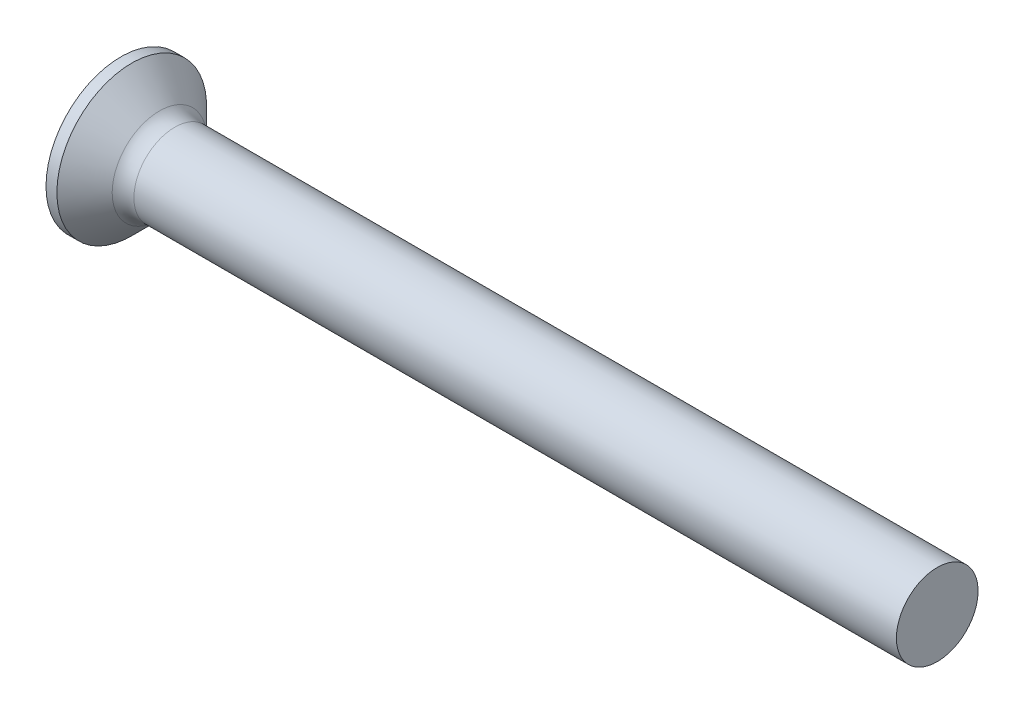
ISO-10303-21;
HEADER;
FILE_DESCRIPTION(('STEP AP214'),'2;1');
FILE_NAME('part.step','',(''),(''),'','','');
FILE_SCHEMA(('AUTOMOTIVE_DESIGN { 1 0 10303 214 1 1 1 1 }'));
ENDSEC;
DATA;
#1=APPLICATION_CONTEXT('core data for automotive mechanical design processes');
#2=APPLICATION_PROTOCOL_DEFINITION('international standard','automotive_design',2000,#1);
#3=PRODUCT_CONTEXT('',#1,'mechanical');
#4=PRODUCT('Part','Part','',(#3));
#5=PRODUCT_RELATED_PRODUCT_CATEGORY('part','',(#4));
#6=PRODUCT_DEFINITION_FORMATION('','',#4);
#7=PRODUCT_DEFINITION_CONTEXT('part definition',#1,'design');
#8=PRODUCT_DEFINITION('design','',#6,#7);
#9=PRODUCT_DEFINITION_SHAPE('','',#8);
#10=(LENGTH_UNIT() NAMED_UNIT(*) SI_UNIT(.MILLI.,.METRE.));
#11=(NAMED_UNIT(*) PLANE_ANGLE_UNIT() SI_UNIT($,.RADIAN.));
#12=(NAMED_UNIT(*) SI_UNIT($,.STERADIAN.) SOLID_ANGLE_UNIT());
#13=UNCERTAINTY_MEASURE_WITH_UNIT(LENGTH_MEASURE(1.E-05),#10,'distance_accuracy_value','');
#14=(GEOMETRIC_REPRESENTATION_CONTEXT(3) GLOBAL_UNCERTAINTY_ASSIGNED_CONTEXT((#13)) GLOBAL_UNIT_ASSIGNED_CONTEXT((#10,
#11,#12)) REPRESENTATION_CONTEXT('',''));
#15=CARTESIAN_POINT('',(0.,0.,0.));
#16=DIRECTION('',(0.,0.,1.));
#17=DIRECTION('',(1.,0.,0.));
#18=AXIS2_PLACEMENT_3D('',#15,#16,#17);
#19=CARTESIAN_POINT('',(2.01,-0.497851135403416,0.37));
#20=DIRECTION('',(0.,0.,-1.));
#21=DIRECTION('',(0.,1.,0.));
#22=AXIS2_PLACEMENT_3D('',#19,#20,#21);
#23=PLANE('',#22);
#24=DIRECTION('',(0.,-1.,0.));
#25=VECTOR('',#24,1.);
#26=CARTESIAN_POINT('',(0.,1.5,0.37));
#27=LINE('',#26,#25);
#28=CARTESIAN_POINT('',(0.,-0.590157547916263,0.37));
#29=VERTEX_POINT('',#28);
#30=CARTESIAN_POINT('',(0.,-1.5,0.37));
#31=VERTEX_POINT('',#30);
#32=EDGE_CURVE('E464',#29,#31,#27,.T.);
#33=ORIENTED_EDGE('',*,*,#32,.F.);
#34=CARTESIAN_POINT('',(-1.01053649699026,-0.672102030078459,0.37));
#35=CARTESIAN_POINT('',(-0.799706058781647,-0.65526709888962,0.37));
#36=CARTESIAN_POINT('',(-0.588886212565099,-0.638297110577309,0.37));
#37=CARTESIAN_POINT('',(-0.167272662573759,-0.603984130523452,0.37));
#38=CARTESIAN_POINT('',(0.0435210405937218,-0.586641131327184,0.37));
#39=CARTESIAN_POINT('',(0.465068838236453,-0.551479911668094,0.37));
#40=CARTESIAN_POINT('',(0.675822932725248,-0.533661691368078,0.37));
#41=CARTESIAN_POINT('',(1.09727362087867,-0.497387538868943,0.37));
#42=CARTESIAN_POINT('',(1.30797021528206,-0.478931615293404,0.37));
#43=CARTESIAN_POINT('',(1.67418894765493,-0.446067164114375,0.37));
#44=CARTESIAN_POINT('',(1.82972932594025,-0.431862501020785,0.37));
#45=CARTESIAN_POINT('',(2.14074770367772,-0.402797709732015,0.37));
#46=CARTESIAN_POINT('',(2.29622570364503,-0.387937587067169,0.37));
#47=CARTESIAN_POINT('',(2.60710169356699,-0.357305117929346,0.37));
#48=CARTESIAN_POINT('',(2.76249967848536,-0.341532719782115,0.37));
#49=CARTESIAN_POINT('',(2.99549070750468,-0.316847908272697,0.37));
#50=CARTESIAN_POINT('',(3.07313791127142,-0.308448465888147,0.37));
#51=CARTESIAN_POINT('',(3.22838341584044,-0.291202251038988,0.37));
#52=CARTESIAN_POINT('',(3.30598171607669,-0.282355473489553,0.37));
#53=CARTESIAN_POINT('',(3.38354828471668,-0.273232461280215,0.37));
#54=B_SPLINE_CURVE_WITH_KNOTS('',3,(#34,#35,#36,#37,#38,#39,#40,#41,#42,#43,#44,#45,#46,#47,#48,
#49,#50,#51,#52,#53),.UNSPECIFIED.,.F.,.F.,(4,2,2,2,2,2,2,2,2,4),(0.,0.634504777580944,
1.26902224771403,1.90353950046914,2.53804817608336,3.00661008454961,3.47516804035678,
3.94375256285268,4.17805198347564,4.41235406796206),.UNSPECIFIED.);
#55=CARTESIAN_POINT('',(2.01,-0.415013252800436,0.37));
#56=VERTEX_POINT('',#55);
#57=EDGE_CURVE('E221',#29,#56,#54,.T.);
#58=ORIENTED_EDGE('',*,*,#57,.T.);
#59=DIRECTION('',(0.,-1.,0.));
#60=VECTOR('',#59,1.);
#61=CARTESIAN_POINT('',(2.01,0.4978511354035,0.37));
#62=LINE('',#61,#60);
#63=CARTESIAN_POINT('',(2.01,-0.497851135403417,0.37));
#64=VERTEX_POINT('',#63);
#65=EDGE_CURVE('E374',#56,#64,#62,.T.);
#66=ORIENTED_EDGE('',*,*,#65,.T.);
#67=DIRECTION('',(0.894934391398435,0.446197753347451,0.));
#68=VECTOR('',#67,1.);
#69=CARTESIAN_POINT('',(0.,-1.5,0.37));
#70=LINE('',#69,#68);
#71=EDGE_CURVE('E472',#31,#64,#70,.T.);
#72=ORIENTED_EDGE('',*,*,#71,.F.);
#73=EDGE_LOOP('',(#33,#58,#66,#72));
#74=FACE_BOUND('',#73,.T.);
#75=ADVANCED_FACE('F41',(#74),#23,.T.);
#76=CARTESIAN_POINT('',(2.01,0.4978511354035,0.37));
#77=VERTEX_POINT('',#76);
#78=CARTESIAN_POINT('',(2.01,0.415013252800436,0.37));
#79=VERTEX_POINT('',#78);
#80=EDGE_CURVE('E370',#77,#79,#62,.T.);
#81=ORIENTED_EDGE('',*,*,#80,.T.);
#82=CARTESIAN_POINT('',(-1.01053649691082,0.672102030072118,0.37));
#83=CARTESIAN_POINT('',(-0.799706058711029,0.655267098883947,0.37));
#84=CARTESIAN_POINT('',(-0.588886212503304,0.638297110572311,0.37));
#85=CARTESIAN_POINT('',(-0.16727266252961,0.603984130519828,0.37));
#86=CARTESIAN_POINT('',(0.0435210406290475,0.586641131324258,0.37));
#87=CARTESIAN_POINT('',(0.465068838244709,0.551479911667385,0.37));
#88=CARTESIAN_POINT('',(0.67582293271526,0.533661691368909,0.37));
#89=CARTESIAN_POINT('',(1.09727362083221,0.497387538872971,0.37));
#90=CARTESIAN_POINT('',(1.30797021521736,0.478931615299089,0.37));
#91=CARTESIAN_POINT('',(1.67418894757201,0.446067164121905,0.37));
#92=CARTESIAN_POINT('',(1.82972932585734,0.431862501028414,0.37));
#93=CARTESIAN_POINT('',(2.14074770359484,0.402797709739879,0.37));
#94=CARTESIAN_POINT('',(2.29622570356215,0.38793758707517,0.37));
#95=CARTESIAN_POINT('',(2.60710169348415,0.357305117937676,0.37));
#96=CARTESIAN_POINT('',(2.76249967840253,0.341532719790639,0.37));
#97=CARTESIAN_POINT('',(2.99549070742189,0.316847908281594,0.37));
#98=CARTESIAN_POINT('',(3.07313791118864,0.308448465897182,0.37));
#99=CARTESIAN_POINT('',(3.22838341575769,0.291202251048339,0.37));
#100=CARTESIAN_POINT('',(3.30598171599396,0.282355473499082,0.37));
#101=CARTESIAN_POINT('',(3.38354828463398,0.27323246128995,0.37));
#102=B_SPLINE_CURVE_WITH_KNOTS('',3,(#82,#83,#84,#85,#86,#87,#88,#89,#90,#91,#92,#93,#94,#95,
#96,#97,#98,#99,#100,#101),.UNSPECIFIED.,.F.,.F.,(4,2,2,2,2,2,2,2,2,4),(0.,0.634504777554397,
1.26902224766093,1.90353950036111,2.53804817592041,3.00661008438666,3.47516804019383,
3.94375256268972,4.17805198331267,4.41235406779909),.UNSPECIFIED.);
#103=CARTESIAN_POINT('',(0.,0.590157547916263,0.37));
#104=VERTEX_POINT('',#103);
#105=EDGE_CURVE('E214',#79,#104,#102,.F.);
#106=ORIENTED_EDGE('',*,*,#105,.T.);
#107=CARTESIAN_POINT('',(0.,1.5,0.37));
#108=VERTEX_POINT('',#107);
#109=EDGE_CURVE('E466',#108,#104,#27,.T.);
#110=ORIENTED_EDGE('',*,*,#109,.F.);
#111=DIRECTION('',(0.89493439139845,-0.446197753347421,0.));
#112=VECTOR('',#111,1.);
#113=CARTESIAN_POINT('',(0.,1.5,0.37));
#114=LINE('',#113,#112);
#115=EDGE_CURVE('E64',#108,#77,#114,.T.);
#116=ORIENTED_EDGE('',*,*,#115,.T.);
#117=EDGE_LOOP('',(#81,#106,#110,#116));
#118=FACE_BOUND('',#117,.T.);
#119=ADVANCED_FACE('F195',(#118),#23,.T.);
#120=CARTESIAN_POINT('',(2.01,0.4978511354035,-0.37));
#121=DIRECTION('',(0.,0.,1.));
#122=DIRECTION('',(0.,-1.,0.));
#123=AXIS2_PLACEMENT_3D('',#120,#121,#122);
#124=PLANE('',#123);
#125=DIRECTION('',(0.,1.,0.));
#126=VECTOR('',#125,1.);
#127=CARTESIAN_POINT('',(2.01,-0.497851135403417,-0.37));
#128=LINE('',#127,#126);
#129=CARTESIAN_POINT('',(2.01,-0.497851135403417,-0.37));
#130=VERTEX_POINT('',#129);
#131=CARTESIAN_POINT('',(2.01,-0.415013252800436,-0.37));
#132=VERTEX_POINT('',#131);
#133=EDGE_CURVE('E383',#130,#132,#128,.T.);
#134=ORIENTED_EDGE('',*,*,#133,.T.);
#135=CARTESIAN_POINT('',(-1.01053649699026,-0.672102030078459,-0.37));
#136=CARTESIAN_POINT('',(-0.799706058781648,-0.65526709888962,-0.37));
#137=CARTESIAN_POINT('',(-0.588886212565099,-0.638297110577309,-0.37));
#138=CARTESIAN_POINT('',(-0.167272662573758,-0.603984130523453,-0.37));
#139=CARTESIAN_POINT('',(0.0435210405937219,-0.586641131327185,-0.37));
#140=CARTESIAN_POINT('',(0.465068838236453,-0.551479911668094,-0.37));
#141=CARTESIAN_POINT('',(0.675822932725248,-0.533661691368078,-0.37));
#142=CARTESIAN_POINT('',(1.09727362087867,-0.497387538868943,-0.37));
#143=CARTESIAN_POINT('',(1.30797021528206,-0.478931615293404,-0.37));
#144=CARTESIAN_POINT('',(1.67418894765493,-0.446067164114376,-0.37));
#145=CARTESIAN_POINT('',(1.82972932594025,-0.431862501020785,-0.37));
#146=CARTESIAN_POINT('',(2.14074770367772,-0.402797709732015,-0.37));
#147=CARTESIAN_POINT('',(2.29622570364503,-0.387937587067169,-0.37));
#148=CARTESIAN_POINT('',(2.60710169356699,-0.357305117929346,-0.37));
#149=CARTESIAN_POINT('',(2.76249967848536,-0.341532719782115,-0.37));
#150=CARTESIAN_POINT('',(2.99549070750468,-0.316847908272698,-0.37));
#151=CARTESIAN_POINT('',(3.07313791127142,-0.308448465888148,-0.37));
#152=CARTESIAN_POINT('',(3.22838341584044,-0.291202251038989,-0.37));
#153=CARTESIAN_POINT('',(3.30598171607669,-0.282355473489553,-0.37));
#154=CARTESIAN_POINT('',(3.38354828471668,-0.273232461280215,-0.37));
#155=B_SPLINE_CURVE_WITH_KNOTS('',3,(#135,#136,#137,#138,#139,#140,#141,#142,#143,#144,#145,
#146,#147,#148,#149,#150,#151,#152,#153,#154),.UNSPECIFIED.,.F.,.F.,(4,2,2,2,2,2,2,2,2,4),(0.,
0.634504777580944,1.26902224771403,1.90353950046914,2.53804817608336,3.00661008454961,
3.47516804035678,3.94375256285268,4.17805198347564,4.41235406796206),.UNSPECIFIED.);
#156=CARTESIAN_POINT('',(0.,-0.590157547916263,-0.37));
#157=VERTEX_POINT('',#156);
#158=EDGE_CURVE('E277',#132,#157,#155,.F.);
#159=ORIENTED_EDGE('',*,*,#158,.T.);
#160=DIRECTION('',(0.,1.,0.));
#161=VECTOR('',#160,1.);
#162=CARTESIAN_POINT('',(0.,-1.5,-0.37));
#163=LINE('',#162,#161);
#164=CARTESIAN_POINT('',(0.,-1.5,-0.37));
#165=VERTEX_POINT('',#164);
#166=EDGE_CURVE('E465',#165,#157,#163,.T.);
#167=ORIENTED_EDGE('',*,*,#166,.F.);
#168=DIRECTION('',(0.894934391398435,0.446197753347451,0.));
#169=VECTOR('',#168,1.);
#170=CARTESIAN_POINT('',(0.,-1.5,-0.37));
#171=LINE('',#170,#169);
#172=EDGE_CURVE('E475',#165,#130,#171,.T.);
#173=ORIENTED_EDGE('',*,*,#172,.T.);
#174=EDGE_LOOP('',(#134,#159,#167,#173));
#175=FACE_BOUND('',#174,.T.);
#176=ADVANCED_FACE('F202',(#175),#124,.T.);
#177=CARTESIAN_POINT('',(0.,0.590157547916263,-0.37));
#178=VERTEX_POINT('',#177);
#179=CARTESIAN_POINT('',(0.,1.5,-0.37));
#180=VERTEX_POINT('',#179);
#181=EDGE_CURVE('E471',#178,#180,#163,.T.);
#182=ORIENTED_EDGE('',*,*,#181,.F.);
#183=CARTESIAN_POINT('',(-1.01053649691082,0.672102030072118,-0.37));
#184=CARTESIAN_POINT('',(-0.79970605871103,0.655267098883947,-0.37));
#185=CARTESIAN_POINT('',(-0.588886212503305,0.638297110572311,-0.37));
#186=CARTESIAN_POINT('',(-0.167272662529611,0.603984130519828,-0.37));
#187=CARTESIAN_POINT('',(0.043521040629047,0.586641131324258,-0.37));
#188=CARTESIAN_POINT('',(0.465068838244709,0.551479911667385,-0.37));
#189=CARTESIAN_POINT('',(0.67582293271526,0.533661691368909,-0.37));
#190=CARTESIAN_POINT('',(1.09727362083221,0.497387538872971,-0.37));
#191=CARTESIAN_POINT('',(1.30797021521736,0.478931615299089,-0.37));
#192=CARTESIAN_POINT('',(1.67418894757201,0.446067164121905,-0.37));
#193=CARTESIAN_POINT('',(1.82972932585734,0.431862501028414,-0.37));
#194=CARTESIAN_POINT('',(2.14074770359484,0.40279770973988,-0.37));
#195=CARTESIAN_POINT('',(2.29622570356215,0.38793758707517,-0.37));
#196=CARTESIAN_POINT('',(2.60710169348415,0.357305117937676,-0.37));
#197=CARTESIAN_POINT('',(2.76249967840253,0.34153271979064,-0.37));
#198=CARTESIAN_POINT('',(2.99549070742189,0.316847908281594,-0.37));
#199=CARTESIAN_POINT('',(3.07313791118864,0.308448465897182,-0.37));
#200=CARTESIAN_POINT('',(3.22838341575769,0.291202251048339,-0.37));
#201=CARTESIAN_POINT('',(3.30598171599396,0.282355473499082,-0.37));
#202=CARTESIAN_POINT('',(3.38354828463398,0.27323246128995,-0.37));
#203=B_SPLINE_CURVE_WITH_KNOTS('',3,(#183,#184,#185,#186,#187,#188,#189,#190,#191,#192,#193,
#194,#195,#196,#197,#198,#199,#200,#201,#202),.UNSPECIFIED.,.F.,.F.,(4,2,2,2,2,2,2,2,2,4),(0.,
0.634504777554396,1.26902224766093,1.90353950036111,2.53804817592041,3.00661008438666,
3.47516804019383,3.94375256268972,4.17805198331267,4.41235406779909),.UNSPECIFIED.);
#204=CARTESIAN_POINT('',(2.01,0.415013252800437,-0.37));
#205=VERTEX_POINT('',#204);
#206=EDGE_CURVE('E271',#178,#205,#203,.T.);
#207=ORIENTED_EDGE('',*,*,#206,.T.);
#208=CARTESIAN_POINT('',(2.01,0.4978511354035,-0.37));
#209=VERTEX_POINT('',#208);
#210=EDGE_CURVE('E385',#205,#209,#128,.T.);
#211=ORIENTED_EDGE('',*,*,#210,.T.);
#212=DIRECTION('',(0.89493439139845,-0.446197753347421,0.));
#213=VECTOR('',#212,1.);
#214=CARTESIAN_POINT('',(0.,1.5,-0.37));
#215=LINE('',#214,#213);
#216=EDGE_CURVE('E382',#180,#209,#215,.T.);
#217=ORIENTED_EDGE('',*,*,#216,.F.);
#218=EDGE_LOOP('',(#182,#207,#211,#217));
#219=FACE_BOUND('',#218,.T.);
#220=ADVANCED_FACE('F482',(#219),#124,.T.);
#221=CARTESIAN_POINT('',(2.01,0.4978511354035,-0.37));
#222=DIRECTION('',(1.,0.,0.));
#223=DIRECTION('',(0.,0.,-1.));
#224=AXIS2_PLACEMENT_3D('',#221,#222,#223);
#225=PLANE('',#224);
#226=CARTESIAN_POINT('',(2.01,0.,0.));
#227=DIRECTION('',(-1.,0.,0.));
#228=DIRECTION('',(0.,0.,1.));
#229=AXIS2_PLACEMENT_3D('',#226,#227,#228);
#230=CIRCLE('',#229,0.555999999999999);
#231=CARTESIAN_POINT('',(2.01,-0.247548473995553,-0.497851135403418));
#232=VERTEX_POINT('',#231);
#233=CARTESIAN_POINT('',(2.01,-0.369999999999999,-0.415013252800438));
#234=VERTEX_POINT('',#233);
#235=EDGE_CURVE('E349',#232,#234,#230,.T.);
#236=ORIENTED_EDGE('',*,*,#235,.F.);
#237=DIRECTION('',(0.,1.,0.));
#238=VECTOR('',#237,1.);
#239=CARTESIAN_POINT('',(2.01,-0.369999999999999,-0.497851135403418));
#240=LINE('',#239,#238);
#241=CARTESIAN_POINT('',(2.01,-0.369999999999999,-0.497851135403418));
#242=VERTEX_POINT('',#241);
#243=EDGE_CURVE('E449',#242,#232,#240,.T.);
#244=ORIENTED_EDGE('',*,*,#243,.F.);
#245=DIRECTION('',(0.,0.,-1.));
#246=VECTOR('',#245,1.);
#247=CARTESIAN_POINT('',(2.01,-0.370000000000002,0.497851135403499));
#248=LINE('',#247,#246);
#249=EDGE_CURVE('E453',#234,#242,#248,.T.);
#250=ORIENTED_EDGE('',*,*,#249,.F.);
#251=EDGE_LOOP('',(#236,#244,#250));
#252=FACE_BOUND('',#251,.T.);
#253=ADVANCED_FACE('F495',(#252),#225,.F.);
#254=CARTESIAN_POINT('',(2.01,-0.497851135403417,-0.247548473995555));
#255=VERTEX_POINT('',#254);
#256=EDGE_CURVE('E344',#132,#255,#230,.T.);
#257=ORIENTED_EDGE('',*,*,#256,.F.);
#258=ORIENTED_EDGE('',*,*,#133,.F.);
#259=DIRECTION('',(0.,0.,-1.));
#260=VECTOR('',#259,1.);
#261=CARTESIAN_POINT('',(2.01,-0.497851135403417,0.37));
#262=LINE('',#261,#260);
#263=EDGE_CURVE('E373',#255,#130,#262,.T.);
#264=ORIENTED_EDGE('',*,*,#263,.F.);
#265=EDGE_LOOP('',(#257,#258,#264));
#266=FACE_BOUND('',#265,.T.);
#267=ADVANCED_FACE('F501',(#266),#225,.F.);
#268=CARTESIAN_POINT('',(2.01,-0.497851135403417,0.247548473995555));
#269=VERTEX_POINT('',#268);
#270=EDGE_CURVE('E339',#269,#56,#230,.T.);
#271=ORIENTED_EDGE('',*,*,#270,.F.);
#272=EDGE_CURVE('E376',#64,#269,#262,.T.);
#273=ORIENTED_EDGE('',*,*,#272,.F.);
#274=ORIENTED_EDGE('',*,*,#65,.F.);
#275=EDGE_LOOP('',(#271,#273,#274));
#276=FACE_BOUND('',#275,.T.);
#277=ADVANCED_FACE('F507',(#276),#225,.F.);
#278=CARTESIAN_POINT('',(2.01,-0.370000000000002,0.415013252800435));
#279=VERTEX_POINT('',#278);
#280=CARTESIAN_POINT('',(2.01,-0.247548473995389,0.497851135403499));
#281=VERTEX_POINT('',#280);
#282=EDGE_CURVE('E56',#279,#281,#230,.T.);
#283=ORIENTED_EDGE('',*,*,#282,.F.);
#284=CARTESIAN_POINT('',(2.01,-0.370000000000002,0.497851135403499));
#285=VERTEX_POINT('',#284);
#286=EDGE_CURVE('E455',#285,#279,#248,.T.);
#287=ORIENTED_EDGE('',*,*,#286,.F.);
#288=DIRECTION('',(0.,-1.,0.));
#289=VECTOR('',#288,1.);
#290=CARTESIAN_POINT('',(2.01,0.369999999999998,0.497851135403501));
#291=LINE('',#290,#289);
#292=EDGE_CURVE('E454',#281,#285,#291,.T.);
#293=ORIENTED_EDGE('',*,*,#292,.F.);
#294=EDGE_LOOP('',(#283,#287,#293));
#295=FACE_BOUND('',#294,.T.);
#296=ADVANCED_FACE('F534',(#295),#225,.F.);
#297=CARTESIAN_POINT('',(2.01,0.247548473995386,0.497851135403501));
#298=VERTEX_POINT('',#297);
#299=CARTESIAN_POINT('',(2.01,0.369999999999999,0.415013252800438));
#300=VERTEX_POINT('',#299);
#301=EDGE_CURVE('E330',#298,#300,#230,.T.);
#302=ORIENTED_EDGE('',*,*,#301,.F.);
#303=CARTESIAN_POINT('',(2.01,0.369999999999998,0.497851135403501));
#304=VERTEX_POINT('',#303);
#305=EDGE_CURVE('E450',#304,#298,#291,.T.);
#306=ORIENTED_EDGE('',*,*,#305,.F.);
#307=DIRECTION('',(0.,0.,1.));
#308=VECTOR('',#307,1.);
#309=CARTESIAN_POINT('',(2.01,0.370000000000002,-0.497851135403416));
#310=LINE('',#309,#308);
#311=EDGE_CURVE('E228',#300,#304,#310,.T.);
#312=ORIENTED_EDGE('',*,*,#311,.F.);
#313=EDGE_LOOP('',(#302,#306,#312));
#314=FACE_BOUND('',#313,.T.);
#315=ADVANCED_FACE('F491',(#314),#225,.F.);
#316=CARTESIAN_POINT('',(2.01,0.4978511354035,0.247548473995388));
#317=VERTEX_POINT('',#316);
#318=EDGE_CURVE('E337',#79,#317,#230,.T.);
#319=ORIENTED_EDGE('',*,*,#318,.F.);
#320=ORIENTED_EDGE('',*,*,#80,.F.);
#321=DIRECTION('',(0.,0.,1.));
#322=VECTOR('',#321,1.);
#323=CARTESIAN_POINT('',(2.01,0.4978511354035,-0.37));
#324=LINE('',#323,#322);
#325=EDGE_CURVE('E371',#317,#77,#324,.T.);
#326=ORIENTED_EDGE('',*,*,#325,.F.);
#327=EDGE_LOOP('',(#319,#320,#326));
#328=FACE_BOUND('',#327,.T.);
#329=ADVANCED_FACE('F369',(#328),#225,.F.);
#330=CARTESIAN_POINT('',(2.01,0.4978511354035,-0.247548473995388));
#331=VERTEX_POINT('',#330);
#332=EDGE_CURVE('E359',#331,#205,#230,.T.);
#333=ORIENTED_EDGE('',*,*,#332,.F.);
#334=EDGE_CURVE('E378',#209,#331,#324,.T.);
#335=ORIENTED_EDGE('',*,*,#334,.F.);
#336=ORIENTED_EDGE('',*,*,#210,.F.);
#337=EDGE_LOOP('',(#333,#335,#336));
#338=FACE_BOUND('',#337,.T.);
#339=ADVANCED_FACE('F484',(#338),#225,.F.);
#340=CARTESIAN_POINT('',(0.,-1.5,-0.37));
#341=DIRECTION('',(-0.446197753347451,0.894934391398435,0.));
#342=DIRECTION('',(-0.894934391398435,-0.446197753347451,0.));
#343=AXIS2_PLACEMENT_3D('',#340,#341,#342);
#344=PLANE('',#343);
#345=ORIENTED_EDGE('',*,*,#272,.T.);
#346=CARTESIAN_POINT('',(2.86902919914407,-0.0695550475538949,0.));
#347=DIRECTION('',(-0.446197753347451,0.894934391398435,0.));
#348=DIRECTION('',(-0.894934391398435,-0.446197753347451,0.));
#349=AXIS2_PLACEMENT_3D('',#346,#347,#348);
#350=ELLIPSE('',#349,1.11145971268774,0.491029001453366);
#351=EDGE_CURVE('E289',#269,#255,#350,.F.);
#352=ORIENTED_EDGE('',*,*,#351,.T.);
#353=ORIENTED_EDGE('',*,*,#263,.T.);
#354=ORIENTED_EDGE('',*,*,#172,.F.);
#355=DIRECTION('',(0.,0.,-1.));
#356=VECTOR('',#355,1.);
#357=CARTESIAN_POINT('',(0.,-1.5,0.37));
#358=LINE('',#357,#356);
#359=EDGE_CURVE('E390',#31,#165,#358,.T.);
#360=ORIENTED_EDGE('',*,*,#359,.F.);
#361=ORIENTED_EDGE('',*,*,#71,.T.);
#362=EDGE_LOOP('',(#345,#352,#353,#354,#360,#361));
#363=FACE_BOUND('',#362,.T.);
#364=ADVANCED_FACE('F208',(#363),#344,.T.);
#365=CARTESIAN_POINT('',(2.01,0.4978511354035,0.37));
#366=DIRECTION('',(-0.446197753347421,-0.89493439139845,0.));
#367=DIRECTION('',(0.89493439139845,-0.446197753347421,0.));
#368=AXIS2_PLACEMENT_3D('',#365,#366,#367);
#369=PLANE('',#368);
#370=ORIENTED_EDGE('',*,*,#334,.T.);
#371=CARTESIAN_POINT('',(2.8690291991443,0.0695550475538988,0.));
#372=DIRECTION('',(-0.446197753347421,-0.89493439139845,0.));
#373=DIRECTION('',(-0.89493439139845,0.446197753347421,0.));
#374=AXIS2_PLACEMENT_3D('',#371,#372,#373);
#375=ELLIPSE('',#374,1.11145971268778,0.491029001453349);
#376=EDGE_CURVE('E294',#331,#317,#375,.F.);
#377=ORIENTED_EDGE('',*,*,#376,.T.);
#378=ORIENTED_EDGE('',*,*,#325,.T.);
#379=ORIENTED_EDGE('',*,*,#115,.F.);
#380=DIRECTION('',(0.,0.,1.));
#381=VECTOR('',#380,1.);
#382=CARTESIAN_POINT('',(0.,1.5,-0.37));
#383=LINE('',#382,#381);
#384=EDGE_CURVE('E461',#180,#108,#383,.T.);
#385=ORIENTED_EDGE('',*,*,#384,.F.);
#386=ORIENTED_EDGE('',*,*,#216,.T.);
#387=EDGE_LOOP('',(#370,#377,#378,#379,#385,#386));
#388=FACE_BOUND('',#387,.T.);
#389=ADVANCED_FACE('F480',(#388),#369,.T.);
#390=CARTESIAN_POINT('',(2.01,0.369999999999998,0.497851135403501));
#391=DIRECTION('',(0.,-1.,0.));
#392=DIRECTION('',(0.,0.,-1.));
#393=AXIS2_PLACEMENT_3D('',#390,#391,#392);
#394=PLANE('',#393);
#395=CARTESIAN_POINT('',(2.01,0.370000000000002,-0.497851135403416));
#396=VERTEX_POINT('',#395);
#397=CARTESIAN_POINT('',(2.01,0.370000000000002,-0.415013252800435));
#398=VERTEX_POINT('',#397);
#399=EDGE_CURVE('E459',#396,#398,#310,.T.);
#400=ORIENTED_EDGE('',*,*,#399,.T.);
#401=CARTESIAN_POINT('',(-1.01053649691082,0.370000000000002,-0.672102030072116));
#402=CARTESIAN_POINT('',(-0.79970605871103,0.370000000000002,-0.655267098883946));
#403=CARTESIAN_POINT('',(-0.588886212503304,0.370000000000002,-0.63829711057231));
#404=CARTESIAN_POINT('',(-0.16727266252961,0.370000000000002,-0.603984130519826));
#405=CARTESIAN_POINT('',(0.0435210406290473,0.370000000000002,-0.586641131324257));
#406=CARTESIAN_POINT('',(0.465068838244709,0.370000000000002,-0.551479911667383));
#407=CARTESIAN_POINT('',(0.67582293271526,0.370000000000002,-0.533661691368908));
#408=CARTESIAN_POINT('',(1.09727362083221,0.370000000000002,-0.497387538872969));
#409=CARTESIAN_POINT('',(1.30797021521736,0.370000000000002,-0.478931615299088));
#410=CARTESIAN_POINT('',(1.67418894757201,0.370000000000002,-0.446067164121904));
#411=CARTESIAN_POINT('',(1.82972932585734,0.370000000000002,-0.431862501028413));
#412=CARTESIAN_POINT('',(2.14074770359484,0.370000000000001,-0.402797709739878));
#413=CARTESIAN_POINT('',(2.29622570356215,0.370000000000001,-0.387937587075169));
#414=CARTESIAN_POINT('',(2.60710169348415,0.370000000000001,-0.357305117937675));
#415=CARTESIAN_POINT('',(2.76249967840253,0.370000000000001,-0.341532719790638));
#416=CARTESIAN_POINT('',(2.99549070742189,0.370000000000001,-0.316847908281593));
#417=CARTESIAN_POINT('',(3.07313791118864,0.370000000000001,-0.308448465897181));
#418=CARTESIAN_POINT('',(3.22838341575769,0.370000000000001,-0.291202251048338));
#419=CARTESIAN_POINT('',(3.30598171599396,0.370000000000001,-0.282355473499081));
#420=CARTESIAN_POINT('',(3.38354828463398,0.370000000000001,-0.273232461289949));
#421=B_SPLINE_CURVE_WITH_KNOTS('',3,(#401,#402,#403,#404,#405,#406,#407,#408,#409,#410,#411,
#412,#413,#414,#415,#416,#417,#418,#419,#420),.UNSPECIFIED.,.F.,.F.,(4,2,2,2,2,2,2,2,2,4),(0.,
0.634504777554397,1.26902224766093,1.90353950036111,2.53804817592041,3.00661008438666,
3.47516804019383,3.94375256268972,4.17805198331267,4.41235406779909),.UNSPECIFIED.);
#422=CARTESIAN_POINT('',(0.,0.370000000000002,-0.590157547916262));
#423=VERTEX_POINT('',#422);
#424=EDGE_CURVE('E263',#398,#423,#421,.F.);
#425=ORIENTED_EDGE('',*,*,#424,.T.);
#426=DIRECTION('',(0.,0.,1.));
#427=VECTOR('',#426,1.);
#428=CARTESIAN_POINT('',(0.,0.370000000000005,-1.5));
#429=LINE('',#428,#427);
#430=CARTESIAN_POINT('',(0.,0.370000000000005,-1.5));
#431=VERTEX_POINT('',#430);
#432=EDGE_CURVE('E435',#431,#423,#429,.T.);
#433=ORIENTED_EDGE('',*,*,#432,.F.);
#434=DIRECTION('',(0.894934391398435,0.,0.446197753347451));
#435=VECTOR('',#434,1.);
#436=CARTESIAN_POINT('',(0.,0.370000000000005,-1.5));
#437=LINE('',#436,#435);
#438=EDGE_CURVE('E441',#431,#396,#437,.T.);
#439=ORIENTED_EDGE('',*,*,#438,.T.);
#440=EDGE_LOOP('',(#400,#425,#433,#439));
#441=FACE_BOUND('',#440,.T.);
#442=ADVANCED_FACE('F615',(#441),#394,.T.);
#443=CARTESIAN_POINT('',(2.01,-0.369999999999999,-0.497851135403418));
#444=DIRECTION('',(0.,1.,0.));
#445=DIRECTION('',(0.,0.,1.));
#446=AXIS2_PLACEMENT_3D('',#443,#444,#445);
#447=PLANE('',#446);
#448=DIRECTION('',(0.,0.,-1.));
#449=VECTOR('',#448,1.);
#450=CARTESIAN_POINT('',(0.,-0.370000000000005,1.5));
#451=LINE('',#450,#449);
#452=CARTESIAN_POINT('',(0.,-0.369999999999998,-0.590157547916264));
#453=VERTEX_POINT('',#452);
#454=CARTESIAN_POINT('',(0.,-0.369999999999995,-1.5));
#455=VERTEX_POINT('',#454);
#456=EDGE_CURVE('E431',#453,#455,#451,.T.);
#457=ORIENTED_EDGE('',*,*,#456,.F.);
#458=CARTESIAN_POINT('',(-1.01053649691082,-0.369999999999998,-0.672102030072119));
#459=CARTESIAN_POINT('',(-0.799706058711029,-0.369999999999998,-0.655267098883948));
#460=CARTESIAN_POINT('',(-0.588886212503304,-0.369999999999998,-0.638297110572312));
#461=CARTESIAN_POINT('',(-0.16727266252961,-0.369999999999998,-0.603984130519829));
#462=CARTESIAN_POINT('',(0.0435210406290474,-0.369999999999998,-0.58664113132426));
#463=CARTESIAN_POINT('',(0.465068838244709,-0.369999999999998,-0.551479911667386));
#464=CARTESIAN_POINT('',(0.67582293271526,-0.369999999999998,-0.53366169136891));
#465=CARTESIAN_POINT('',(1.09727362083221,-0.369999999999998,-0.497387538872972));
#466=CARTESIAN_POINT('',(1.30797021521736,-0.369999999999998,-0.47893161529909));
#467=CARTESIAN_POINT('',(1.67418894757201,-0.369999999999999,-0.446067164121906));
#468=CARTESIAN_POINT('',(1.82972932585734,-0.369999999999999,-0.431862501028415));
#469=CARTESIAN_POINT('',(2.14074770359484,-0.369999999999999,-0.402797709739881));
#470=CARTESIAN_POINT('',(2.29622570356215,-0.369999999999999,-0.387937587075171));
#471=CARTESIAN_POINT('',(2.60710169348415,-0.369999999999999,-0.357305117937677));
#472=CARTESIAN_POINT('',(2.76249967840253,-0.369999999999999,-0.341532719790641));
#473=CARTESIAN_POINT('',(2.99549070742189,-0.369999999999999,-0.316847908281595));
#474=CARTESIAN_POINT('',(3.07313791118864,-0.369999999999999,-0.308448465897183));
#475=CARTESIAN_POINT('',(3.22838341575769,-0.369999999999999,-0.29120225104834));
#476=CARTESIAN_POINT('',(3.30598171599396,-0.369999999999999,-0.282355473499083));
#477=CARTESIAN_POINT('',(3.38354828463398,-0.369999999999999,-0.273232461289951));
#478=B_SPLINE_CURVE_WITH_KNOTS('',3,(#458,#459,#460,#461,#462,#463,#464,#465,#466,#467,#468,
#469,#470,#471,#472,#473,#474,#475,#476,#477),.UNSPECIFIED.,.F.,.F.,(4,2,2,2,2,2,2,2,2,4),(0.,
0.634504777554397,1.26902224766093,1.90353950036111,2.53804817592041,3.00661008438666,
3.47516804019383,3.94375256268972,4.17805198331267,4.41235406779909),.UNSPECIFIED.);
#479=EDGE_CURVE('E256',#453,#234,#478,.T.);
#480=ORIENTED_EDGE('',*,*,#479,.T.);
#481=ORIENTED_EDGE('',*,*,#249,.T.);
#482=DIRECTION('',(0.894934391398435,0.,0.446197753347451));
#483=VECTOR('',#482,1.);
#484=CARTESIAN_POINT('',(0.,-0.369999999999995,-1.5));
#485=LINE('',#484,#483);
#486=EDGE_CURVE('E438',#455,#242,#485,.T.);
#487=ORIENTED_EDGE('',*,*,#486,.F.);
#488=EDGE_LOOP('',(#457,#480,#481,#487));
#489=FACE_BOUND('',#488,.T.);
#490=ADVANCED_FACE('F512',(#489),#447,.T.);
#491=CARTESIAN_POINT('',(0.,0.370000000000005,-1.5));
#492=DIRECTION('',(-0.446197753347451,0.,0.894934391398435));
#493=DIRECTION('',(-0.894934391398435,0.,-0.446197753347451));
#494=AXIS2_PLACEMENT_3D('',#491,#492,#493);
#495=PLANE('',#494);
#496=ORIENTED_EDGE('',*,*,#243,.T.);
#497=CARTESIAN_POINT('',(2.86902919914407,0.,-0.0695550475538949));
#498=DIRECTION('',(-0.446197753347451,0.,0.894934391398435));
#499=DIRECTION('',(-0.894934391398435,0.,-0.446197753347451));
#500=AXIS2_PLACEMENT_3D('',#497,#498,#499);
#501=ELLIPSE('',#500,1.11145971268774,0.491029001453366);
#502=CARTESIAN_POINT('',(2.01,0.247548473995556,-0.497851135403416));
#503=VERTEX_POINT('',#502);
#504=EDGE_CURVE('E307',#232,#503,#501,.F.);
#505=ORIENTED_EDGE('',*,*,#504,.T.);
#506=EDGE_CURVE('E457',#503,#396,#240,.T.);
#507=ORIENTED_EDGE('',*,*,#506,.T.);
#508=ORIENTED_EDGE('',*,*,#438,.F.);
#509=DIRECTION('',(0.,1.,0.));
#510=VECTOR('',#509,1.);
#511=CARTESIAN_POINT('',(0.,-0.369999999999995,-1.5));
#512=LINE('',#511,#510);
#513=EDGE_CURVE('E430',#455,#431,#512,.T.);
#514=ORIENTED_EDGE('',*,*,#513,.F.);
#515=ORIENTED_EDGE('',*,*,#486,.T.);
#516=EDGE_LOOP('',(#496,#505,#507,#508,#514,#515));
#517=FACE_BOUND('',#516,.T.);
#518=ADVANCED_FACE('F233',(#517),#495,.T.);
#519=ORIENTED_EDGE('',*,*,#286,.T.);
#520=CARTESIAN_POINT('',(-1.01053649699026,-0.370000000000002,0.672102030078458));
#521=CARTESIAN_POINT('',(-0.799706058781648,-0.370000000000002,0.655267098889619));
#522=CARTESIAN_POINT('',(-0.588886212565099,-0.370000000000002,0.638297110577308));
#523=CARTESIAN_POINT('',(-0.167272662573759,-0.370000000000002,0.603984130523451));
#524=CARTESIAN_POINT('',(0.0435210405937217,-0.370000000000002,0.586641131327183));
#525=CARTESIAN_POINT('',(0.465068838236452,-0.370000000000002,0.551479911668093));
#526=CARTESIAN_POINT('',(0.675822932725247,-0.370000000000002,0.533661691368077));
#527=CARTESIAN_POINT('',(1.09727362087867,-0.370000000000002,0.497387538868941));
#528=CARTESIAN_POINT('',(1.30797021528206,-0.370000000000002,0.478931615293402));
#529=CARTESIAN_POINT('',(1.67418894765493,-0.370000000000002,0.446067164114374));
#530=CARTESIAN_POINT('',(1.82972932594025,-0.370000000000002,0.431862501020784));
#531=CARTESIAN_POINT('',(2.14074770367772,-0.370000000000001,0.402797709732014));
#532=CARTESIAN_POINT('',(2.29622570364503,-0.370000000000001,0.387937587067168));
#533=CARTESIAN_POINT('',(2.60710169356699,-0.370000000000001,0.357305117929345));
#534=CARTESIAN_POINT('',(2.76249967848536,-0.370000000000001,0.341532719782114));
#535=CARTESIAN_POINT('',(2.99549070750468,-0.370000000000001,0.316847908272696));
#536=CARTESIAN_POINT('',(3.07313791127142,-0.370000000000001,0.308448465888146));
#537=CARTESIAN_POINT('',(3.22838341584044,-0.370000000000001,0.291202251038987));
#538=CARTESIAN_POINT('',(3.30598171607669,-0.370000000000001,0.282355473489552));
#539=CARTESIAN_POINT('',(3.38354828471668,-0.370000000000001,0.273232461280214));
#540=B_SPLINE_CURVE_WITH_KNOTS('',3,(#520,#521,#522,#523,#524,#525,#526,#527,#528,#529,#530,
#531,#532,#533,#534,#535,#536,#537,#538,#539),.UNSPECIFIED.,.F.,.F.,(4,2,2,2,2,2,2,2,2,4),(0.,
0.634504777580944,1.26902224771403,1.90353950046914,2.53804817608336,3.00661008454961,
3.47516804035678,3.94375256285268,4.17805198347564,4.41235406796206),.UNSPECIFIED.);
#541=CARTESIAN_POINT('',(0.,-0.370000000000002,0.590157547916262));
#542=VERTEX_POINT('',#541);
#543=EDGE_CURVE('E248',#279,#542,#540,.F.);
#544=ORIENTED_EDGE('',*,*,#543,.T.);
#545=CARTESIAN_POINT('',(0.,-0.370000000000005,1.5));
#546=VERTEX_POINT('',#545);
#547=EDGE_CURVE('E426',#546,#542,#451,.T.);
#548=ORIENTED_EDGE('',*,*,#547,.F.);
#549=DIRECTION('',(0.89493439139845,0.,-0.446197753347421));
#550=VECTOR('',#549,1.);
#551=CARTESIAN_POINT('',(0.,-0.370000000000005,1.5));
#552=LINE('',#551,#550);
#553=EDGE_CURVE('E444',#546,#285,#552,.T.);
#554=ORIENTED_EDGE('',*,*,#553,.T.);
#555=EDGE_LOOP('',(#519,#544,#548,#554));
#556=FACE_BOUND('',#555,.T.);
#557=ADVANCED_FACE('F532',(#556),#447,.T.);
#558=CARTESIAN_POINT('',(0.,0.369999999999998,0.590157547916264));
#559=VERTEX_POINT('',#558);
#560=CARTESIAN_POINT('',(0.,0.369999999999994,1.5));
#561=VERTEX_POINT('',#560);
#562=EDGE_CURVE('E437',#559,#561,#429,.T.);
#563=ORIENTED_EDGE('',*,*,#562,.F.);
#564=CARTESIAN_POINT('',(-1.01053649699026,0.369999999999997,0.67210203007846));
#565=CARTESIAN_POINT('',(-0.799706058781648,0.369999999999997,0.655267098889622));
#566=CARTESIAN_POINT('',(-0.588886212565099,0.369999999999997,0.638297110577311));
#567=CARTESIAN_POINT('',(-0.167272662573758,0.369999999999998,0.603984130523454));
#568=CARTESIAN_POINT('',(0.0435210405937219,0.369999999999998,0.586641131327186));
#569=CARTESIAN_POINT('',(0.465068838236453,0.369999999999998,0.551479911668095));
#570=CARTESIAN_POINT('',(0.675822932725248,0.369999999999998,0.53366169136808));
#571=CARTESIAN_POINT('',(1.09727362087867,0.369999999999998,0.497387538868944));
#572=CARTESIAN_POINT('',(1.30797021528206,0.369999999999998,0.478931615293405));
#573=CARTESIAN_POINT('',(1.67418894765493,0.369999999999998,0.446067164114377));
#574=CARTESIAN_POINT('',(1.82972932594025,0.369999999999998,0.431862501020786));
#575=CARTESIAN_POINT('',(2.14074770367772,0.369999999999999,0.402797709732016));
#576=CARTESIAN_POINT('',(2.29622570364503,0.369999999999999,0.387937587067171));
#577=CARTESIAN_POINT('',(2.60710169356699,0.369999999999999,0.357305117929347));
#578=CARTESIAN_POINT('',(2.76249967848536,0.369999999999999,0.341532719782116));
#579=CARTESIAN_POINT('',(2.99549070750468,0.369999999999999,0.316847908272699));
#580=CARTESIAN_POINT('',(3.07313791127142,0.369999999999999,0.308448465888149));
#581=CARTESIAN_POINT('',(3.22838341584044,0.369999999999999,0.29120225103899));
#582=CARTESIAN_POINT('',(3.30598171607669,0.369999999999999,0.282355473489554));
#583=CARTESIAN_POINT('',(3.38354828471668,0.369999999999999,0.273232461280216));
#584=B_SPLINE_CURVE_WITH_KNOTS('',3,(#564,#565,#566,#567,#568,#569,#570,#571,#572,#573,#574,
#575,#576,#577,#578,#579,#580,#581,#582,#583),.UNSPECIFIED.,.F.,.F.,(4,2,2,2,2,2,2,2,2,4),(0.,
0.634504777580944,1.26902224771403,1.90353950046914,2.53804817608336,3.00661008454961,
3.47516804035678,3.94375256285268,4.17805198347564,4.41235406796206),.UNSPECIFIED.);
#585=EDGE_CURVE('E238',#559,#300,#584,.T.);
#586=ORIENTED_EDGE('',*,*,#585,.T.);
#587=ORIENTED_EDGE('',*,*,#311,.T.);
#588=DIRECTION('',(0.89493439139845,0.,-0.446197753347421));
#589=VECTOR('',#588,1.);
#590=CARTESIAN_POINT('',(0.,0.369999999999994,1.5));
#591=LINE('',#590,#589);
#592=EDGE_CURVE('E446',#561,#304,#591,.T.);
#593=ORIENTED_EDGE('',*,*,#592,.F.);
#594=EDGE_LOOP('',(#563,#586,#587,#593));
#595=FACE_BOUND('',#594,.T.);
#596=ADVANCED_FACE('F527',(#595),#394,.T.);
#597=CARTESIAN_POINT('',(2.01,-0.370000000000002,0.497851135403499));
#598=DIRECTION('',(-0.446197753347421,0.,-0.89493439139845));
#599=DIRECTION('',(0.89493439139845,0.,-0.446197753347421));
#600=AXIS2_PLACEMENT_3D('',#597,#598,#599);
#601=PLANE('',#600);
#602=ORIENTED_EDGE('',*,*,#305,.T.);
#603=CARTESIAN_POINT('',(2.8690291991443,0.,0.0695550475538988));
#604=DIRECTION('',(-0.446197753347421,0.,-0.89493439139845));
#605=DIRECTION('',(-0.89493439139845,0.,0.446197753347421));
#606=AXIS2_PLACEMENT_3D('',#603,#604,#605);
#607=ELLIPSE('',#606,1.11145971268778,0.491029001453349);
#608=EDGE_CURVE('E11',#298,#281,#607,.F.);
#609=ORIENTED_EDGE('',*,*,#608,.T.);
#610=ORIENTED_EDGE('',*,*,#292,.T.);
#611=ORIENTED_EDGE('',*,*,#553,.F.);
#612=DIRECTION('',(0.,-1.,0.));
#613=VECTOR('',#612,1.);
#614=CARTESIAN_POINT('',(0.,0.369999999999994,1.5));
#615=LINE('',#614,#613);
#616=EDGE_CURVE('E229',#561,#546,#615,.T.);
#617=ORIENTED_EDGE('',*,*,#616,.F.);
#618=ORIENTED_EDGE('',*,*,#592,.T.);
#619=EDGE_LOOP('',(#602,#609,#610,#611,#617,#618));
#620=FACE_BOUND('',#619,.T.);
#621=ADVANCED_FACE('F424',(#620),#601,.T.);
#622=CARTESIAN_POINT('',(0.,0.,0.));
#623=DIRECTION('',(-1.,0.,0.));
#624=DIRECTION('',(0.,0.,1.));
#625=AXIS2_PLACEMENT_3D('',#622,#623,#624);
#626=PLANE('',#625);
#627=CARTESIAN_POINT('',(0.,0.,0.));
#628=DIRECTION('',(-1.,0.,0.));
#629=DIRECTION('',(0.,0.,1.));
#630=AXIS2_PLACEMENT_3D('',#627,#628,#629);
#631=CIRCLE('',#630,2.75);
#632=CARTESIAN_POINT('',(0.,0.,2.75));
#633=VERTEX_POINT('',#632);
#634=EDGE_CURVE('E393',#633,#633,#631,.T.);
#635=ORIENTED_EDGE('',*,*,#634,.T.);
#636=EDGE_LOOP('',(#635));
#637=FACE_BOUND('',#636,.T.);
#638=ORIENTED_EDGE('',*,*,#547,.T.);
#639=CARTESIAN_POINT('',(0.,0.,0.));
#640=DIRECTION('',(-1.,0.,0.));
#641=DIRECTION('',(0.,0.,1.));
#642=AXIS2_PLACEMENT_3D('',#639,#640,#641);
#643=CIRCLE('',#642,0.696552892006441);
#644=EDGE_CURVE('E325',#29,#542,#643,.T.);
#645=ORIENTED_EDGE('',*,*,#644,.F.);
#646=ORIENTED_EDGE('',*,*,#32,.T.);
#647=ORIENTED_EDGE('',*,*,#359,.T.);
#648=ORIENTED_EDGE('',*,*,#166,.T.);
#649=EDGE_CURVE('E328',#453,#157,#643,.T.);
#650=ORIENTED_EDGE('',*,*,#649,.F.);
#651=ORIENTED_EDGE('',*,*,#456,.T.);
#652=ORIENTED_EDGE('',*,*,#513,.T.);
#653=ORIENTED_EDGE('',*,*,#432,.T.);
#654=EDGE_CURVE('E324',#178,#423,#643,.T.);
#655=ORIENTED_EDGE('',*,*,#654,.F.);
#656=ORIENTED_EDGE('',*,*,#181,.T.);
#657=ORIENTED_EDGE('',*,*,#384,.T.);
#658=ORIENTED_EDGE('',*,*,#109,.T.);
#659=EDGE_CURVE('E320',#559,#104,#643,.T.);
#660=ORIENTED_EDGE('',*,*,#659,.F.);
#661=ORIENTED_EDGE('',*,*,#562,.T.);
#662=ORIENTED_EDGE('',*,*,#616,.T.);
#663=EDGE_LOOP('',(#638,#645,#646,#647,#648,#650,#651,#652,#653,#655,#656,#657,#658,#660,#661,#662));
#664=FACE_BOUND('',#663,.T.);
#665=ADVANCED_FACE('F418',(#637,#664),#626,.T.);
#666=CARTESIAN_POINT('',(-6.34999999999999,0.,0.));
#667=DIRECTION('',(-1.,0.,0.));
#668=DIRECTION('',(0.,0.,1.));
#669=AXIS2_PLACEMENT_3D('',#666,#667,#668);
#670=CYLINDRICAL_SURFACE('',#669,2.75);
#671=CARTESIAN_POINT('',(0.400000000000006,0.,0.));
#672=DIRECTION('',(-1.,0.,0.));
#673=DIRECTION('',(0.,0.,1.));
#674=AXIS2_PLACEMENT_3D('',#671,#672,#673);
#675=CIRCLE('',#674,2.75);
#676=CARTESIAN_POINT('',(0.400000000000006,0.,2.75));
#677=VERTEX_POINT('',#676);
#678=EDGE_CURVE('E389',#677,#677,#675,.T.);
#679=ORIENTED_EDGE('',*,*,#678,.T.);
#680=EDGE_LOOP('',(#679));
#681=FACE_BOUND('',#680,.T.);
#682=ORIENTED_EDGE('',*,*,#634,.F.);
#683=EDGE_LOOP('',(#682));
#684=FACE_BOUND('',#683,.T.);
#685=ADVANCED_FACE('F412',(#681,#684),#670,.T.);
#686=CARTESIAN_POINT('',(0.400000000000006,0.,0.));
#687=DIRECTION('',(-1.,0.,0.));
#688=DIRECTION('',(0.,0.,1.));
#689=AXIS2_PLACEMENT_3D('',#686,#687,#688);
#690=CONICAL_SURFACE('',#689,2.75,0.78539816339745);
#691=CARTESIAN_POINT('',(1.41568542494924,0.,0.));
#692=DIRECTION('',(-1.,0.,0.));
#693=DIRECTION('',(0.,0.,1.));
#694=AXIS2_PLACEMENT_3D('',#691,#692,#693);
#695=CIRCLE('',#694,1.73431457505076);
#696=CARTESIAN_POINT('',(1.41568542494924,0.,1.73431457505076));
#697=VERTEX_POINT('',#696);
#698=EDGE_CURVE('E396',#697,#697,#695,.T.);
#699=ORIENTED_EDGE('',*,*,#698,.T.);
#700=EDGE_LOOP('',(#699));
#701=FACE_BOUND('',#700,.T.);
#702=ORIENTED_EDGE('',*,*,#678,.F.);
#703=EDGE_LOOP('',(#702));
#704=FACE_BOUND('',#703,.T.);
#705=ADVANCED_FACE('F409',(#701,#704),#690,.T.);
#706=CARTESIAN_POINT('',(-6.34999999999999,0.,0.));
#707=DIRECTION('',(-1.,0.,0.));
#708=DIRECTION('',(0.,0.,1.));
#709=AXIS2_PLACEMENT_3D('',#706,#707,#708);
#710=CYLINDRICAL_SURFACE('',#709,1.5);
#711=CARTESIAN_POINT('',(1.98137084989848,0.,0.));
#712=DIRECTION('',(-1.,0.,0.));
#713=DIRECTION('',(0.,0.,1.));
#714=AXIS2_PLACEMENT_3D('',#711,#712,#713);
#715=CIRCLE('',#714,1.5);
#716=CARTESIAN_POINT('',(1.98137084989848,0.,1.5));
#717=VERTEX_POINT('',#716);
#718=EDGE_CURVE('E49',#717,#717,#715,.F.);
#719=ORIENTED_EDGE('',*,*,#718,.T.);
#720=EDGE_LOOP('',(#719));
#721=FACE_BOUND('',#720,.T.);
#722=CARTESIAN_POINT('',(30.,0.,0.));
#723=DIRECTION('',(-1.,0.,0.));
#724=DIRECTION('',(0.,0.,1.));
#725=AXIS2_PLACEMENT_3D('',#722,#723,#724);
#726=CIRCLE('',#725,1.5);
#727=CARTESIAN_POINT('',(30.,0.,1.5));
#728=VERTEX_POINT('',#727);
#729=EDGE_CURVE('E386',#728,#728,#726,.T.);
#730=ORIENTED_EDGE('',*,*,#729,.T.);
#731=EDGE_LOOP('',(#730));
#732=FACE_BOUND('',#731,.T.);
#733=ADVANCED_FACE('F401',(#721,#732),#710,.T.);
#734=CARTESIAN_POINT('',(30.,1.5,0.));
#735=DIRECTION('',(1.,0.,0.));
#736=DIRECTION('',(0.,0.,-1.));
#737=AXIS2_PLACEMENT_3D('',#734,#735,#736);
#738=PLANE('',#737);
#739=ORIENTED_EDGE('',*,*,#729,.F.);
#740=EDGE_LOOP('',(#739));
#741=FACE_BOUND('',#740,.T.);
#742=ADVANCED_FACE('F406',(#741),#738,.T.);
#743=CARTESIAN_POINT('',(1.98137084989848,0.,0.));
#744=DIRECTION('',(-1.,0.,0.));
#745=DIRECTION('',(0.,0.,1.));
#746=AXIS2_PLACEMENT_3D('',#743,#744,#745);
#747=TOROIDAL_SURFACE('',#746,2.3,0.8);
#748=ORIENTED_EDGE('',*,*,#718,.F.);
#749=EDGE_LOOP('',(#748));
#750=FACE_BOUND('',#749,.T.);
#751=ORIENTED_EDGE('',*,*,#698,.F.);
#752=EDGE_LOOP('',(#751));
#753=FACE_BOUND('',#752,.T.);
#754=ADVANCED_FACE('F43',(#750,#753),#747,.F.);
#755=EDGE_CURVE('E354',#398,#503,#230,.T.);
#756=ORIENTED_EDGE('',*,*,#755,.F.);
#757=ORIENTED_EDGE('',*,*,#399,.F.);
#758=ORIENTED_EDGE('',*,*,#506,.F.);
#759=EDGE_LOOP('',(#756,#757,#758));
#760=FACE_BOUND('',#759,.T.);
#761=ADVANCED_FACE('F405',(#760),#225,.F.);
#762=CARTESIAN_POINT('',(2.01,0.,0.));
#763=DIRECTION('',(-1.,0.,0.));
#764=DIRECTION('',(0.,0.,1.));
#765=AXIS2_PLACEMENT_3D('',#762,#763,#764);
#766=CONICAL_SURFACE('',#765,0.555999999999999,0.069813170079766);
#767=ORIENTED_EDGE('',*,*,#644,.T.);
#768=ORIENTED_EDGE('',*,*,#543,.F.);
#769=EDGE_CURVE('E338',#56,#279,#230,.T.);
#770=ORIENTED_EDGE('',*,*,#769,.F.);
#771=ORIENTED_EDGE('',*,*,#57,.F.);
#772=EDGE_LOOP('',(#767,#768,#770,#771));
#773=FACE_BOUND('',#772,.T.);
#774=ADVANCED_FACE('F192',(#773),#766,.F.);
#775=EDGE_CURVE('E333',#300,#79,#230,.T.);
#776=ORIENTED_EDGE('',*,*,#775,.F.);
#777=ORIENTED_EDGE('',*,*,#585,.F.);
#778=ORIENTED_EDGE('',*,*,#659,.T.);
#779=ORIENTED_EDGE('',*,*,#105,.F.);
#780=EDGE_LOOP('',(#776,#777,#778,#779));
#781=FACE_BOUND('',#780,.T.);
#782=ADVANCED_FACE('F499',(#781),#766,.F.);
#783=EDGE_CURVE('E346',#234,#132,#230,.T.);
#784=ORIENTED_EDGE('',*,*,#783,.F.);
#785=ORIENTED_EDGE('',*,*,#479,.F.);
#786=ORIENTED_EDGE('',*,*,#649,.T.);
#787=ORIENTED_EDGE('',*,*,#158,.F.);
#788=EDGE_LOOP('',(#784,#785,#786,#787));
#789=FACE_BOUND('',#788,.T.);
#790=ADVANCED_FACE('F515',(#789),#766,.F.);
#791=ORIENTED_EDGE('',*,*,#654,.T.);
#792=ORIENTED_EDGE('',*,*,#424,.F.);
#793=EDGE_CURVE('E356',#205,#398,#230,.T.);
#794=ORIENTED_EDGE('',*,*,#793,.F.);
#795=ORIENTED_EDGE('',*,*,#206,.F.);
#796=EDGE_LOOP('',(#791,#792,#794,#795));
#797=FACE_BOUND('',#796,.T.);
#798=ADVANCED_FACE('F517',(#797),#766,.F.);
#799=EDGE_CURVE('E361',#317,#331,#230,.T.);
#800=ORIENTED_EDGE('',*,*,#799,.F.);
#801=ORIENTED_EDGE('',*,*,#376,.F.);
#802=EDGE_LOOP('',(#800,#801));
#803=FACE_BOUND('',#802,.T.);
#804=ADVANCED_FACE('F522',(#803),#766,.F.);
#805=EDGE_CURVE('E341',#255,#269,#230,.T.);
#806=ORIENTED_EDGE('',*,*,#805,.F.);
#807=ORIENTED_EDGE('',*,*,#351,.F.);
#808=EDGE_LOOP('',(#806,#807));
#809=FACE_BOUND('',#808,.T.);
#810=ADVANCED_FACE('F762',(#809),#766,.F.);
#811=EDGE_CURVE('E351',#503,#232,#230,.T.);
#812=ORIENTED_EDGE('',*,*,#811,.F.);
#813=ORIENTED_EDGE('',*,*,#504,.F.);
#814=EDGE_LOOP('',(#812,#813));
#815=FACE_BOUND('',#814,.T.);
#816=ADVANCED_FACE('F189',(#815),#766,.F.);
#817=EDGE_CURVE('E334',#281,#298,#230,.T.);
#818=ORIENTED_EDGE('',*,*,#817,.F.);
#819=ORIENTED_EDGE('',*,*,#608,.F.);
#820=EDGE_LOOP('',(#818,#819));
#821=FACE_BOUND('',#820,.T.);
#822=ADVANCED_FACE('F184',(#821),#766,.F.);
#823=CARTESIAN_POINT('',(2.19065535110549,0.,0.));
#824=DIRECTION('',(-1.,0.,0.));
#825=DIRECTION('',(0.,0.,1.));
#826=AXIS2_PLACEMENT_3D('',#823,#824,#825);
#827=CONICAL_SURFACE('',#826,0.,1.25663706143592);
#828=ORIENTED_EDGE('',*,*,#301,.T.);
#829=ORIENTED_EDGE('',*,*,#775,.T.);
#830=ORIENTED_EDGE('',*,*,#318,.T.);
#831=ORIENTED_EDGE('',*,*,#799,.T.);
#832=ORIENTED_EDGE('',*,*,#332,.T.);
#833=ORIENTED_EDGE('',*,*,#793,.T.);
#834=ORIENTED_EDGE('',*,*,#755,.T.);
#835=ORIENTED_EDGE('',*,*,#811,.T.);
#836=ORIENTED_EDGE('',*,*,#235,.T.);
#837=ORIENTED_EDGE('',*,*,#783,.T.);
#838=ORIENTED_EDGE('',*,*,#256,.T.);
#839=ORIENTED_EDGE('',*,*,#805,.T.);
#840=ORIENTED_EDGE('',*,*,#270,.T.);
#841=ORIENTED_EDGE('',*,*,#769,.T.);
#842=ORIENTED_EDGE('',*,*,#282,.T.);
#843=ORIENTED_EDGE('',*,*,#817,.T.);
#844=EDGE_LOOP('',(#828,#829,#830,#831,#832,#833,#834,#835,#836,#837,#838,#839,#840,#841,#842,#843));
#845=FACE_BOUND('',#844,.T.);
#846=CARTESIAN_POINT('',(2.19065535110549,0.,0.));
#847=VERTEX_POINT('',#846);
#848=VERTEX_LOOP('',#847);
#849=FACE_BOUND('',#848,.T.);
#850=ADVANCED_FACE('F182',(#845,#849),#827,.F.);
#851=CLOSED_SHELL('',(#75,#119,#176,#220,#253,#267,#277,#296,#315,#329,#339,#364,#389,#442,#490,
#518,#557,#596,#621,#665,#685,#705,#733,#742,#754,#761,#774,#782,#790,#798,#804,#810,#816,#822,#850));
#852=MANIFOLD_SOLID_BREP('B2',#851);
#853=ADVANCED_BREP_SHAPE_REPRESENTATION('',(#18,#852),#14);
#854=SHAPE_DEFINITION_REPRESENTATION(#9,#853);
ENDSEC;
END-ISO-10303-21;
